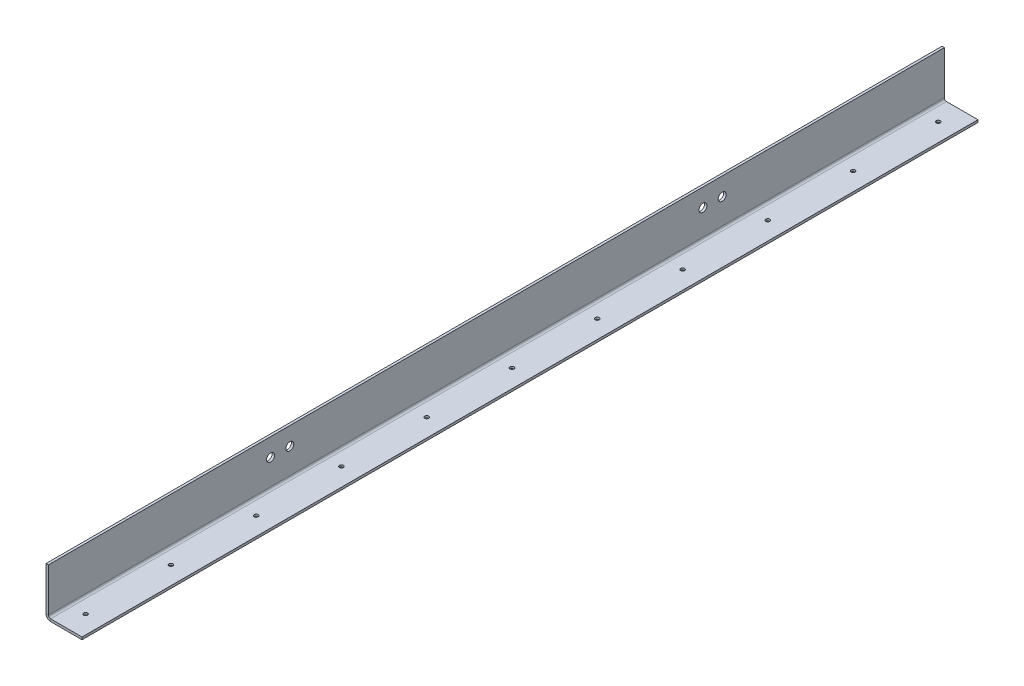
ISO-10303-21;
HEADER;
FILE_DESCRIPTION(('STEP AP214'),'2;1');
FILE_NAME('part.step','',(''),(''),'','','');
FILE_SCHEMA(('AUTOMOTIVE_DESIGN { 1 0 10303 214 1 1 1 1 }'));
ENDSEC;
DATA;
#1=APPLICATION_CONTEXT('core data for automotive mechanical design processes');
#2=APPLICATION_PROTOCOL_DEFINITION('international standard','automotive_design',2000,#1);
#3=PRODUCT_CONTEXT('',#1,'mechanical');
#4=PRODUCT('Part','Part','',(#3));
#5=PRODUCT_RELATED_PRODUCT_CATEGORY('part','',(#4));
#6=PRODUCT_DEFINITION_FORMATION('','',#4);
#7=PRODUCT_DEFINITION_CONTEXT('part definition',#1,'design');
#8=PRODUCT_DEFINITION('design','',#6,#7);
#9=PRODUCT_DEFINITION_SHAPE('','',#8);
#10=(LENGTH_UNIT() NAMED_UNIT(*) SI_UNIT(.MILLI.,.METRE.));
#11=(NAMED_UNIT(*) PLANE_ANGLE_UNIT() SI_UNIT($,.RADIAN.));
#12=(NAMED_UNIT(*) SI_UNIT($,.STERADIAN.) SOLID_ANGLE_UNIT());
#13=UNCERTAINTY_MEASURE_WITH_UNIT(LENGTH_MEASURE(1.E-05),#10,'distance_accuracy_value','');
#14=(GEOMETRIC_REPRESENTATION_CONTEXT(3) GLOBAL_UNCERTAINTY_ASSIGNED_CONTEXT((#13)) GLOBAL_UNIT_ASSIGNED_CONTEXT((#10,
#11,#12)) REPRESENTATION_CONTEXT('',''));
#15=CARTESIAN_POINT('',(0.,0.,0.));
#16=DIRECTION('',(0.,0.,1.));
#17=DIRECTION('',(1.,0.,0.));
#18=AXIS2_PLACEMENT_3D('',#15,#16,#17);
#19=CARTESIAN_POINT('',(0.,3.8,746.));
#20=DIRECTION('',(0.,0.,1.));
#21=DIRECTION('',(1.,0.,0.));
#22=AXIS2_PLACEMENT_3D('',#19,#20,#21);
#23=PLANE('',#22);
#24=DIRECTION('',(1.,0.,0.));
#25=VECTOR('',#24,1.);
#26=CARTESIAN_POINT('',(0.,3.8,746.));
#27=LINE('',#26,#25);
#28=CARTESIAN_POINT('',(0.,3.8,746.));
#29=VERTEX_POINT('',#28);
#30=CARTESIAN_POINT('',(2.,3.8,746.));
#31=VERTEX_POINT('',#30);
#32=EDGE_CURVE('E11',#29,#31,#27,.T.);
#33=ORIENTED_EDGE('',*,*,#32,.F.);
#34=CARTESIAN_POINT('',(3.8,3.8,746.));
#35=DIRECTION('',(0.,0.,1.));
#36=DIRECTION('',(1.,0.,0.));
#37=AXIS2_PLACEMENT_3D('',#34,#35,#36);
#38=CIRCLE('',#37,3.8);
#39=CARTESIAN_POINT('',(3.8,0.,746.));
#40=VERTEX_POINT('',#39);
#41=EDGE_CURVE('E138',#40,#29,#38,.F.);
#42=ORIENTED_EDGE('',*,*,#41,.F.);
#43=DIRECTION('',(0.,-1.,0.));
#44=VECTOR('',#43,1.);
#45=CARTESIAN_POINT('',(3.8,2.,746.));
#46=LINE('',#45,#44);
#47=CARTESIAN_POINT('',(3.8,2.,746.));
#48=VERTEX_POINT('',#47);
#49=EDGE_CURVE('E48',#48,#40,#46,.T.);
#50=ORIENTED_EDGE('',*,*,#49,.F.);
#51=CARTESIAN_POINT('',(3.8,3.8,746.));
#52=DIRECTION('',(0.,0.,1.));
#53=DIRECTION('',(1.,0.,0.));
#54=AXIS2_PLACEMENT_3D('',#51,#52,#53);
#55=CIRCLE('',#54,1.8);
#56=EDGE_CURVE('E131',#48,#31,#55,.F.);
#57=ORIENTED_EDGE('',*,*,#56,.T.);
#58=EDGE_LOOP('',(#33,#42,#50,#57));
#59=FACE_BOUND('',#58,.T.);
#60=ADVANCED_FACE('F39',(#59),#23,.T.);
#61=CARTESIAN_POINT('',(3.8,2.,746.));
#62=DIRECTION('',(0.,0.,1.));
#63=DIRECTION('',(1.,0.,0.));
#64=AXIS2_PLACEMENT_3D('',#61,#62,#63);
#65=PLANE('',#64);
#66=DIRECTION('',(0.,1.,0.));
#67=VECTOR('',#66,1.);
#68=CARTESIAN_POINT('',(0.,0.,746.));
#69=LINE('',#68,#67);
#70=CARTESIAN_POINT('',(0.,40.,746.));
#71=VERTEX_POINT('',#70);
#72=EDGE_CURVE('E277',#29,#71,#69,.T.);
#73=ORIENTED_EDGE('',*,*,#72,.F.);
#74=ORIENTED_EDGE('',*,*,#32,.T.);
#75=DIRECTION('',(0.,1.,0.));
#76=VECTOR('',#75,1.);
#77=CARTESIAN_POINT('',(2.,0.,746.));
#78=LINE('',#77,#76);
#79=CARTESIAN_POINT('',(2.,40.,746.));
#80=VERTEX_POINT('',#79);
#81=EDGE_CURVE('E97',#31,#80,#78,.T.);
#82=ORIENTED_EDGE('',*,*,#81,.T.);
#83=DIRECTION('',(1.,0.,0.));
#84=VECTOR('',#83,1.);
#85=CARTESIAN_POINT('',(0.,40.,746.));
#86=LINE('',#85,#84);
#87=EDGE_CURVE('E274',#71,#80,#86,.T.);
#88=ORIENTED_EDGE('',*,*,#87,.F.);
#89=EDGE_LOOP('',(#73,#74,#82,#88));
#90=FACE_BOUND('',#89,.T.);
#91=ADVANCED_FACE('F297',(#90),#65,.T.);
#92=CARTESIAN_POINT('',(3.8,0.,0.));
#93=DIRECTION('',(0.,0.,-1.));
#94=DIRECTION('',(-1.,0.,0.));
#95=AXIS2_PLACEMENT_3D('',#92,#93,#94);
#96=PLANE('',#95);
#97=DIRECTION('',(0.,1.,0.));
#98=VECTOR('',#97,1.);
#99=CARTESIAN_POINT('',(3.8,0.,0.));
#100=LINE('',#99,#98);
#101=CARTESIAN_POINT('',(3.8,0.,0.));
#102=VERTEX_POINT('',#101);
#103=CARTESIAN_POINT('',(3.8,2.,0.));
#104=VERTEX_POINT('',#103);
#105=EDGE_CURVE('E84',#102,#104,#100,.T.);
#106=ORIENTED_EDGE('',*,*,#105,.F.);
#107=CARTESIAN_POINT('',(3.8,3.8,0.));
#108=DIRECTION('',(0.,0.,1.));
#109=DIRECTION('',(1.,0.,0.));
#110=AXIS2_PLACEMENT_3D('',#107,#108,#109);
#111=CIRCLE('',#110,3.8);
#112=CARTESIAN_POINT('',(0.,3.8,0.));
#113=VERTEX_POINT('',#112);
#114=EDGE_CURVE('E154',#102,#113,#111,.F.);
#115=ORIENTED_EDGE('',*,*,#114,.T.);
#116=DIRECTION('',(-1.,0.,0.));
#117=VECTOR('',#116,1.);
#118=CARTESIAN_POINT('',(2.,3.8,0.));
#119=LINE('',#118,#117);
#120=CARTESIAN_POINT('',(2.,3.8,0.));
#121=VERTEX_POINT('',#120);
#122=EDGE_CURVE('E91',#121,#113,#119,.T.);
#123=ORIENTED_EDGE('',*,*,#122,.F.);
#124=CARTESIAN_POINT('',(3.8,3.8,0.));
#125=DIRECTION('',(0.,0.,1.));
#126=DIRECTION('',(1.,0.,0.));
#127=AXIS2_PLACEMENT_3D('',#124,#125,#126);
#128=CIRCLE('',#127,1.8);
#129=EDGE_CURVE('E161',#104,#121,#128,.F.);
#130=ORIENTED_EDGE('',*,*,#129,.F.);
#131=EDGE_LOOP('',(#106,#115,#123,#130));
#132=FACE_BOUND('',#131,.T.);
#133=ADVANCED_FACE('F295',(#132),#96,.T.);
#134=CARTESIAN_POINT('',(2.,3.8,0.));
#135=DIRECTION('',(0.,0.,-1.));
#136=DIRECTION('',(-1.,0.,0.));
#137=AXIS2_PLACEMENT_3D('',#134,#135,#136);
#138=PLANE('',#137);
#139=DIRECTION('',(-1.,0.,0.));
#140=VECTOR('',#139,1.);
#141=CARTESIAN_POINT('',(0.,0.,0.));
#142=LINE('',#141,#140);
#143=CARTESIAN_POINT('',(30.,0.,0.));
#144=VERTEX_POINT('',#143);
#145=EDGE_CURVE('E156',#144,#102,#142,.T.);
#146=ORIENTED_EDGE('',*,*,#145,.T.);
#147=ORIENTED_EDGE('',*,*,#105,.T.);
#148=DIRECTION('',(1.,0.,0.));
#149=VECTOR('',#148,1.);
#150=CARTESIAN_POINT('',(0.,2.,0.));
#151=LINE('',#150,#149);
#152=CARTESIAN_POINT('',(30.,2.,0.));
#153=VERTEX_POINT('',#152);
#154=EDGE_CURVE('E159',#153,#104,#151,.F.);
#155=ORIENTED_EDGE('',*,*,#154,.F.);
#156=DIRECTION('',(0.,-1.,0.));
#157=VECTOR('',#156,1.);
#158=CARTESIAN_POINT('',(30.,2.,0.));
#159=LINE('',#158,#157);
#160=EDGE_CURVE('E119',#153,#144,#159,.T.);
#161=ORIENTED_EDGE('',*,*,#160,.T.);
#162=EDGE_LOOP('',(#146,#147,#155,#161));
#163=FACE_BOUND('',#162,.T.);
#164=ADVANCED_FACE('F291',(#163),#138,.T.);
#165=CARTESIAN_POINT('',(2.,0.,746.));
#166=DIRECTION('',(-1.,0.,0.));
#167=DIRECTION('',(0.,0.,1.));
#168=AXIS2_PLACEMENT_3D('',#165,#166,#167);
#169=PLANE('',#168);
#170=CARTESIAN_POINT('',(2.,25.,561.));
#171=DIRECTION('',(-1.,0.,0.));
#172=DIRECTION('',(0.,0.,1.));
#173=AXIS2_PLACEMENT_3D('',#170,#171,#172);
#174=CIRCLE('',#173,3.29999999999999);
#175=CARTESIAN_POINT('',(2.,25.,564.3));
#176=VERTEX_POINT('',#175);
#177=EDGE_CURVE('E705',#176,#176,#174,.T.);
#178=ORIENTED_EDGE('',*,*,#177,.T.);
#179=EDGE_LOOP('',(#178));
#180=FACE_BOUND('',#179,.T.);
#181=CARTESIAN_POINT('',(2.,25.,545.));
#182=DIRECTION('',(-1.,0.,0.));
#183=DIRECTION('',(0.,0.,1.));
#184=AXIS2_PLACEMENT_3D('',#181,#182,#183);
#185=CIRCLE('',#184,3.29999999999999);
#186=CARTESIAN_POINT('',(2.,25.,548.3));
#187=VERTEX_POINT('',#186);
#188=EDGE_CURVE('E709',#187,#187,#185,.T.);
#189=ORIENTED_EDGE('',*,*,#188,.T.);
#190=EDGE_LOOP('',(#189));
#191=FACE_BOUND('',#190,.T.);
#192=CARTESIAN_POINT('',(2.,25.,185.));
#193=DIRECTION('',(-1.,0.,0.));
#194=DIRECTION('',(0.,0.,1.));
#195=AXIS2_PLACEMENT_3D('',#192,#193,#194);
#196=CIRCLE('',#195,3.29999999999999);
#197=CARTESIAN_POINT('',(2.,25.,188.3));
#198=VERTEX_POINT('',#197);
#199=EDGE_CURVE('E718',#198,#198,#196,.T.);
#200=ORIENTED_EDGE('',*,*,#199,.T.);
#201=EDGE_LOOP('',(#200));
#202=FACE_BOUND('',#201,.T.);
#203=CARTESIAN_POINT('',(2.,25.,201.));
#204=DIRECTION('',(-1.,0.,0.));
#205=DIRECTION('',(0.,0.,1.));
#206=AXIS2_PLACEMENT_3D('',#203,#204,#205);
#207=CIRCLE('',#206,3.29999999999999);
#208=CARTESIAN_POINT('',(2.,25.,204.3));
#209=VERTEX_POINT('',#208);
#210=EDGE_CURVE('E724',#209,#209,#207,.T.);
#211=ORIENTED_EDGE('',*,*,#210,.T.);
#212=EDGE_LOOP('',(#211));
#213=FACE_BOUND('',#212,.T.);
#214=DIRECTION('',(0.,1.,0.));
#215=VECTOR('',#214,1.);
#216=CARTESIAN_POINT('',(2.,0.,0.));
#217=LINE('',#216,#215);
#218=CARTESIAN_POINT('',(2.,40.,0.));
#219=VERTEX_POINT('',#218);
#220=EDGE_CURVE('E144',#121,#219,#217,.T.);
#221=ORIENTED_EDGE('',*,*,#220,.T.);
#222=DIRECTION('',(0.,0.,-1.));
#223=VECTOR('',#222,1.);
#224=CARTESIAN_POINT('',(2.,40.,746.));
#225=LINE('',#224,#223);
#226=EDGE_CURVE('E175',#80,#219,#225,.T.);
#227=ORIENTED_EDGE('',*,*,#226,.F.);
#228=ORIENTED_EDGE('',*,*,#81,.F.);
#229=DIRECTION('',(0.,0.,-1.));
#230=VECTOR('',#229,1.);
#231=CARTESIAN_POINT('',(2.,3.8,746.));
#232=LINE('',#231,#230);
#233=EDGE_CURVE('E143',#31,#121,#232,.T.);
#234=ORIENTED_EDGE('',*,*,#233,.T.);
#235=EDGE_LOOP('',(#221,#227,#228,#234));
#236=FACE_BOUND('',#235,.T.);
#237=ADVANCED_FACE('F303',(#180,#191,#202,#213,#236),#169,.F.);
#238=CARTESIAN_POINT('',(0.,40.,746.));
#239=DIRECTION('',(0.,1.,0.));
#240=DIRECTION('',(0.,0.,1.));
#241=AXIS2_PLACEMENT_3D('',#238,#239,#240);
#242=PLANE('',#241);
#243=DIRECTION('',(1.,0.,0.));
#244=VECTOR('',#243,1.);
#245=CARTESIAN_POINT('',(0.,40.,0.));
#246=LINE('',#245,#244);
#247=CARTESIAN_POINT('',(0.,40.,0.));
#248=VERTEX_POINT('',#247);
#249=EDGE_CURVE('E147',#248,#219,#246,.T.);
#250=ORIENTED_EDGE('',*,*,#249,.F.);
#251=DIRECTION('',(0.,0.,-1.));
#252=VECTOR('',#251,1.);
#253=CARTESIAN_POINT('',(0.,40.,746.));
#254=LINE('',#253,#252);
#255=EDGE_CURVE('E173',#71,#248,#254,.T.);
#256=ORIENTED_EDGE('',*,*,#255,.F.);
#257=ORIENTED_EDGE('',*,*,#87,.T.);
#258=ORIENTED_EDGE('',*,*,#226,.T.);
#259=EDGE_LOOP('',(#250,#256,#257,#258));
#260=FACE_BOUND('',#259,.T.);
#261=ADVANCED_FACE('F332',(#260),#242,.T.);
#262=CARTESIAN_POINT('',(0.,0.,746.));
#263=DIRECTION('',(-1.,0.,0.));
#264=DIRECTION('',(0.,0.,1.));
#265=AXIS2_PLACEMENT_3D('',#262,#263,#264);
#266=PLANE('',#265);
#267=CARTESIAN_POINT('',(0.,25.,561.));
#268=DIRECTION('',(-1.,0.,0.));
#269=DIRECTION('',(0.,0.,1.));
#270=AXIS2_PLACEMENT_3D('',#267,#268,#269);
#271=CIRCLE('',#270,3.29999999999999);
#272=CARTESIAN_POINT('',(0.,25.,564.3));
#273=VERTEX_POINT('',#272);
#274=EDGE_CURVE('E702',#273,#273,#271,.T.);
#275=ORIENTED_EDGE('',*,*,#274,.F.);
#276=EDGE_LOOP('',(#275));
#277=FACE_BOUND('',#276,.T.);
#278=CARTESIAN_POINT('',(0.,25.,545.));
#279=DIRECTION('',(-1.,0.,0.));
#280=DIRECTION('',(0.,0.,1.));
#281=AXIS2_PLACEMENT_3D('',#278,#279,#280);
#282=CIRCLE('',#281,3.29999999999999);
#283=CARTESIAN_POINT('',(0.,25.,548.3));
#284=VERTEX_POINT('',#283);
#285=EDGE_CURVE('E706',#284,#284,#282,.T.);
#286=ORIENTED_EDGE('',*,*,#285,.F.);
#287=EDGE_LOOP('',(#286));
#288=FACE_BOUND('',#287,.T.);
#289=CARTESIAN_POINT('',(0.,25.,185.));
#290=DIRECTION('',(-1.,0.,0.));
#291=DIRECTION('',(0.,0.,1.));
#292=AXIS2_PLACEMENT_3D('',#289,#290,#291);
#293=CIRCLE('',#292,3.29999999999999);
#294=CARTESIAN_POINT('',(0.,25.,188.3));
#295=VERTEX_POINT('',#294);
#296=EDGE_CURVE('E715',#295,#295,#293,.T.);
#297=ORIENTED_EDGE('',*,*,#296,.F.);
#298=EDGE_LOOP('',(#297));
#299=FACE_BOUND('',#298,.T.);
#300=CARTESIAN_POINT('',(0.,25.,201.));
#301=DIRECTION('',(-1.,0.,0.));
#302=DIRECTION('',(0.,0.,1.));
#303=AXIS2_PLACEMENT_3D('',#300,#301,#302);
#304=CIRCLE('',#303,3.29999999999999);
#305=CARTESIAN_POINT('',(0.,25.,204.3));
#306=VERTEX_POINT('',#305);
#307=EDGE_CURVE('E721',#306,#306,#304,.T.);
#308=ORIENTED_EDGE('',*,*,#307,.F.);
#309=EDGE_LOOP('',(#308));
#310=FACE_BOUND('',#309,.T.);
#311=DIRECTION('',(0.,1.,0.));
#312=VECTOR('',#311,1.);
#313=CARTESIAN_POINT('',(0.,0.,0.));
#314=LINE('',#313,#312);
#315=EDGE_CURVE('E151',#113,#248,#314,.T.);
#316=ORIENTED_EDGE('',*,*,#315,.F.);
#317=DIRECTION('',(0.,0.,-1.));
#318=VECTOR('',#317,1.);
#319=CARTESIAN_POINT('',(0.,3.8,746.));
#320=LINE('',#319,#318);
#321=EDGE_CURVE('E170',#29,#113,#320,.T.);
#322=ORIENTED_EDGE('',*,*,#321,.F.);
#323=ORIENTED_EDGE('',*,*,#72,.T.);
#324=ORIENTED_EDGE('',*,*,#255,.T.);
#325=EDGE_LOOP('',(#316,#322,#323,#324));
#326=FACE_BOUND('',#325,.T.);
#327=ADVANCED_FACE('F337',(#277,#288,#299,#310,#326),#266,.T.);
#328=CARTESIAN_POINT('',(3.8,3.8,746.));
#329=DIRECTION('',(0.,0.,-1.));
#330=DIRECTION('',(-1.,0.,0.));
#331=AXIS2_PLACEMENT_3D('',#328,#329,#330);
#332=CYLINDRICAL_SURFACE('',#331,3.8);
#333=ORIENTED_EDGE('',*,*,#114,.F.);
#334=DIRECTION('',(0.,0.,-1.));
#335=VECTOR('',#334,1.);
#336=CARTESIAN_POINT('',(3.8,0.,746.));
#337=LINE('',#336,#335);
#338=EDGE_CURVE('E167',#40,#102,#337,.T.);
#339=ORIENTED_EDGE('',*,*,#338,.F.);
#340=ORIENTED_EDGE('',*,*,#41,.T.);
#341=ORIENTED_EDGE('',*,*,#321,.T.);
#342=EDGE_LOOP('',(#333,#339,#340,#341));
#343=FACE_BOUND('',#342,.T.);
#344=ADVANCED_FACE('F284',(#343),#332,.T.);
#345=CARTESIAN_POINT('',(0.,0.,746.));
#346=DIRECTION('',(0.,-1.,0.));
#347=DIRECTION('',(0.,0.,-1.));
#348=AXIS2_PLACEMENT_3D('',#345,#346,#347);
#349=PLANE('',#348);
#350=CARTESIAN_POINT('',(15.,0.,18.));
#351=DIRECTION('',(0.,-1.,0.));
#352=DIRECTION('',(0.,0.,-1.));
#353=AXIS2_PLACEMENT_3D('',#350,#351,#352);
#354=CIRCLE('',#353,2.025);
#355=CARTESIAN_POINT('',(15.,0.,15.975));
#356=VERTEX_POINT('',#355);
#357=EDGE_CURVE('E727',#356,#356,#354,.T.);
#358=ORIENTED_EDGE('',*,*,#357,.F.);
#359=EDGE_LOOP('',(#358));
#360=FACE_BOUND('',#359,.T.);
#361=CARTESIAN_POINT('',(15.,0.,89.));
#362=DIRECTION('',(0.,-1.,0.));
#363=DIRECTION('',(0.,0.,-1.));
#364=AXIS2_PLACEMENT_3D('',#361,#362,#363);
#365=CIRCLE('',#364,2.025);
#366=CARTESIAN_POINT('',(15.,0.,86.975));
#367=VERTEX_POINT('',#366);
#368=EDGE_CURVE('E231',#367,#367,#365,.T.);
#369=ORIENTED_EDGE('',*,*,#368,.F.);
#370=EDGE_LOOP('',(#369));
#371=FACE_BOUND('',#370,.T.);
#372=CARTESIAN_POINT('',(15.,0.,160.));
#373=DIRECTION('',(0.,-1.,0.));
#374=DIRECTION('',(0.,0.,-1.));
#375=AXIS2_PLACEMENT_3D('',#372,#373,#374);
#376=CIRCLE('',#375,2.025);
#377=CARTESIAN_POINT('',(15.,0.,157.975));
#378=VERTEX_POINT('',#377);
#379=EDGE_CURVE('E224',#378,#378,#376,.T.);
#380=ORIENTED_EDGE('',*,*,#379,.F.);
#381=EDGE_LOOP('',(#380));
#382=FACE_BOUND('',#381,.T.);
#383=CARTESIAN_POINT('',(15.,0.,231.));
#384=DIRECTION('',(0.,-1.,0.));
#385=DIRECTION('',(0.,0.,-1.));
#386=AXIS2_PLACEMENT_3D('',#383,#384,#385);
#387=CIRCLE('',#386,2.025);
#388=CARTESIAN_POINT('',(15.,0.,228.975));
#389=VERTEX_POINT('',#388);
#390=EDGE_CURVE('E220',#389,#389,#387,.T.);
#391=ORIENTED_EDGE('',*,*,#390,.F.);
#392=EDGE_LOOP('',(#391));
#393=FACE_BOUND('',#392,.T.);
#394=CARTESIAN_POINT('',(15.,0.,302.));
#395=DIRECTION('',(0.,-1.,0.));
#396=DIRECTION('',(0.,0.,-1.));
#397=AXIS2_PLACEMENT_3D('',#394,#395,#396);
#398=CIRCLE('',#397,2.025);
#399=CARTESIAN_POINT('',(15.,0.,299.975));
#400=VERTEX_POINT('',#399);
#401=EDGE_CURVE('E216',#400,#400,#398,.T.);
#402=ORIENTED_EDGE('',*,*,#401,.F.);
#403=EDGE_LOOP('',(#402));
#404=FACE_BOUND('',#403,.T.);
#405=CARTESIAN_POINT('',(15.,0.,373.));
#406=DIRECTION('',(0.,-1.,0.));
#407=DIRECTION('',(0.,0.,-1.));
#408=AXIS2_PLACEMENT_3D('',#405,#406,#407);
#409=CIRCLE('',#408,2.025);
#410=CARTESIAN_POINT('',(15.,0.,370.975));
#411=VERTEX_POINT('',#410);
#412=EDGE_CURVE('E211',#411,#411,#409,.T.);
#413=ORIENTED_EDGE('',*,*,#412,.F.);
#414=EDGE_LOOP('',(#413));
#415=FACE_BOUND('',#414,.T.);
#416=CARTESIAN_POINT('',(14.9999999999999,0.,444.));
#417=DIRECTION('',(0.,-1.,0.));
#418=DIRECTION('',(0.,0.,-1.));
#419=AXIS2_PLACEMENT_3D('',#416,#417,#418);
#420=CIRCLE('',#419,2.025);
#421=CARTESIAN_POINT('',(14.9999999999999,0.,441.975));
#422=VERTEX_POINT('',#421);
#423=EDGE_CURVE('E206',#422,#422,#420,.T.);
#424=ORIENTED_EDGE('',*,*,#423,.F.);
#425=EDGE_LOOP('',(#424));
#426=FACE_BOUND('',#425,.T.);
#427=CARTESIAN_POINT('',(14.9999999999999,0.,515.));
#428=DIRECTION('',(0.,-1.,0.));
#429=DIRECTION('',(0.,0.,-1.));
#430=AXIS2_PLACEMENT_3D('',#427,#428,#429);
#431=CIRCLE('',#430,2.025);
#432=CARTESIAN_POINT('',(14.9999999999999,0.,512.975));
#433=VERTEX_POINT('',#432);
#434=EDGE_CURVE('E201',#433,#433,#431,.T.);
#435=ORIENTED_EDGE('',*,*,#434,.F.);
#436=EDGE_LOOP('',(#435));
#437=FACE_BOUND('',#436,.T.);
#438=CARTESIAN_POINT('',(14.9999999999999,0.,586.));
#439=DIRECTION('',(0.,-1.,0.));
#440=DIRECTION('',(0.,0.,-1.));
#441=AXIS2_PLACEMENT_3D('',#438,#439,#440);
#442=CIRCLE('',#441,2.025);
#443=CARTESIAN_POINT('',(14.9999999999999,0.,583.975));
#444=VERTEX_POINT('',#443);
#445=EDGE_CURVE('E196',#444,#444,#442,.T.);
#446=ORIENTED_EDGE('',*,*,#445,.F.);
#447=EDGE_LOOP('',(#446));
#448=FACE_BOUND('',#447,.T.);
#449=CARTESIAN_POINT('',(14.9999999999999,0.,657.));
#450=DIRECTION('',(0.,-1.,0.));
#451=DIRECTION('',(0.,0.,-1.));
#452=AXIS2_PLACEMENT_3D('',#449,#450,#451);
#453=CIRCLE('',#452,2.025);
#454=CARTESIAN_POINT('',(14.9999999999999,0.,654.975));
#455=VERTEX_POINT('',#454);
#456=EDGE_CURVE('E191',#455,#455,#453,.T.);
#457=ORIENTED_EDGE('',*,*,#456,.F.);
#458=EDGE_LOOP('',(#457));
#459=FACE_BOUND('',#458,.T.);
#460=CARTESIAN_POINT('',(14.9999999999999,0.,728.));
#461=DIRECTION('',(0.,-1.,0.));
#462=DIRECTION('',(0.,0.,-1.));
#463=AXIS2_PLACEMENT_3D('',#460,#461,#462);
#464=CIRCLE('',#463,2.025);
#465=CARTESIAN_POINT('',(14.9999999999999,0.,725.975));
#466=VERTEX_POINT('',#465);
#467=EDGE_CURVE('E186',#466,#466,#464,.T.);
#468=ORIENTED_EDGE('',*,*,#467,.F.);
#469=EDGE_LOOP('',(#468));
#470=FACE_BOUND('',#469,.T.);
#471=ORIENTED_EDGE('',*,*,#145,.F.);
#472=DIRECTION('',(0.,0.,-1.));
#473=VECTOR('',#472,1.);
#474=CARTESIAN_POINT('',(30.,0.,746.));
#475=LINE('',#474,#473);
#476=CARTESIAN_POINT('',(30.,0.,746.));
#477=VERTEX_POINT('',#476);
#478=EDGE_CURVE('E121',#477,#144,#475,.T.);
#479=ORIENTED_EDGE('',*,*,#478,.F.);
#480=DIRECTION('',(-1.,0.,0.));
#481=VECTOR('',#480,1.);
#482=CARTESIAN_POINT('',(0.,0.,746.));
#483=LINE('',#482,#481);
#484=EDGE_CURVE('E136',#477,#40,#483,.T.);
#485=ORIENTED_EDGE('',*,*,#484,.T.);
#486=ORIENTED_EDGE('',*,*,#338,.T.);
#487=EDGE_LOOP('',(#471,#479,#485,#486));
#488=FACE_BOUND('',#487,.T.);
#489=ADVANCED_FACE('F290',(#360,#371,#382,#393,#404,#415,#426,#437,#448,#459,#470,#488),#349,.T.);
#490=CARTESIAN_POINT('',(30.,2.,746.));
#491=DIRECTION('',(1.,0.,0.));
#492=DIRECTION('',(0.,0.,-1.));
#493=AXIS2_PLACEMENT_3D('',#490,#491,#492);
#494=PLANE('',#493);
#495=ORIENTED_EDGE('',*,*,#160,.F.);
#496=DIRECTION('',(0.,0.,-1.));
#497=VECTOR('',#496,1.);
#498=CARTESIAN_POINT('',(30.,2.,746.));
#499=LINE('',#498,#497);
#500=CARTESIAN_POINT('',(30.,2.,746.));
#501=VERTEX_POINT('',#500);
#502=EDGE_CURVE('E113',#501,#153,#499,.T.);
#503=ORIENTED_EDGE('',*,*,#502,.F.);
#504=DIRECTION('',(0.,-1.,0.));
#505=VECTOR('',#504,1.);
#506=CARTESIAN_POINT('',(30.,2.,746.));
#507=LINE('',#506,#505);
#508=EDGE_CURVE('E117',#501,#477,#507,.T.);
#509=ORIENTED_EDGE('',*,*,#508,.T.);
#510=ORIENTED_EDGE('',*,*,#478,.T.);
#511=EDGE_LOOP('',(#495,#503,#509,#510));
#512=FACE_BOUND('',#511,.T.);
#513=ADVANCED_FACE('F115',(#512),#494,.T.);
#514=CARTESIAN_POINT('',(0.,2.,746.));
#515=DIRECTION('',(0.,-1.,0.));
#516=DIRECTION('',(0.,0.,-1.));
#517=AXIS2_PLACEMENT_3D('',#514,#515,#516);
#518=PLANE('',#517);
#519=CARTESIAN_POINT('',(15.,2.,18.));
#520=DIRECTION('',(0.,-1.,0.));
#521=DIRECTION('',(0.,0.,-1.));
#522=AXIS2_PLACEMENT_3D('',#519,#520,#521);
#523=CIRCLE('',#522,1.64999999999999);
#524=CARTESIAN_POINT('',(15.,2.,16.35));
#525=VERTEX_POINT('',#524);
#526=EDGE_CURVE('E42',#525,#525,#523,.T.);
#527=ORIENTED_EDGE('',*,*,#526,.T.);
#528=EDGE_LOOP('',(#527));
#529=FACE_BOUND('',#528,.T.);
#530=CARTESIAN_POINT('',(15.,2.,89.));
#531=DIRECTION('',(0.,-1.,0.));
#532=DIRECTION('',(0.,0.,-1.));
#533=AXIS2_PLACEMENT_3D('',#530,#531,#532);
#534=CIRCLE('',#533,1.64999999999999);
#535=CARTESIAN_POINT('',(15.,2.,87.35));
#536=VERTEX_POINT('',#535);
#537=EDGE_CURVE('E222',#536,#536,#534,.T.);
#538=ORIENTED_EDGE('',*,*,#537,.T.);
#539=EDGE_LOOP('',(#538));
#540=FACE_BOUND('',#539,.T.);
#541=CARTESIAN_POINT('',(15.,2.,160.));
#542=DIRECTION('',(0.,-1.,0.));
#543=DIRECTION('',(0.,0.,-1.));
#544=AXIS2_PLACEMENT_3D('',#541,#542,#543);
#545=CIRCLE('',#544,1.64999999999999);
#546=CARTESIAN_POINT('',(15.,2.,158.35));
#547=VERTEX_POINT('',#546);
#548=EDGE_CURVE('E218',#547,#547,#545,.T.);
#549=ORIENTED_EDGE('',*,*,#548,.T.);
#550=EDGE_LOOP('',(#549));
#551=FACE_BOUND('',#550,.T.);
#552=CARTESIAN_POINT('',(15.,2.,231.));
#553=DIRECTION('',(0.,-1.,0.));
#554=DIRECTION('',(0.,0.,-1.));
#555=AXIS2_PLACEMENT_3D('',#552,#553,#554);
#556=CIRCLE('',#555,1.64999999999999);
#557=CARTESIAN_POINT('',(15.,2.,229.35));
#558=VERTEX_POINT('',#557);
#559=EDGE_CURVE('E213',#558,#558,#556,.T.);
#560=ORIENTED_EDGE('',*,*,#559,.T.);
#561=EDGE_LOOP('',(#560));
#562=FACE_BOUND('',#561,.T.);
#563=CARTESIAN_POINT('',(15.,2.,302.));
#564=DIRECTION('',(0.,-1.,0.));
#565=DIRECTION('',(0.,0.,-1.));
#566=AXIS2_PLACEMENT_3D('',#563,#564,#565);
#567=CIRCLE('',#566,1.64999999999999);
#568=CARTESIAN_POINT('',(15.,2.,300.35));
#569=VERTEX_POINT('',#568);
#570=EDGE_CURVE('E208',#569,#569,#567,.T.);
#571=ORIENTED_EDGE('',*,*,#570,.T.);
#572=EDGE_LOOP('',(#571));
#573=FACE_BOUND('',#572,.T.);
#574=CARTESIAN_POINT('',(15.,2.,373.));
#575=DIRECTION('',(0.,-1.,0.));
#576=DIRECTION('',(0.,0.,-1.));
#577=AXIS2_PLACEMENT_3D('',#574,#575,#576);
#578=CIRCLE('',#577,1.64999999999999);
#579=CARTESIAN_POINT('',(15.,2.,371.35));
#580=VERTEX_POINT('',#579);
#581=EDGE_CURVE('E203',#580,#580,#578,.T.);
#582=ORIENTED_EDGE('',*,*,#581,.T.);
#583=EDGE_LOOP('',(#582));
#584=FACE_BOUND('',#583,.T.);
#585=CARTESIAN_POINT('',(14.9999999999999,2.,444.));
#586=DIRECTION('',(0.,-1.,0.));
#587=DIRECTION('',(0.,0.,-1.));
#588=AXIS2_PLACEMENT_3D('',#585,#586,#587);
#589=CIRCLE('',#588,1.64999999999999);
#590=CARTESIAN_POINT('',(14.9999999999999,2.,442.35));
#591=VERTEX_POINT('',#590);
#592=EDGE_CURVE('E198',#591,#591,#589,.T.);
#593=ORIENTED_EDGE('',*,*,#592,.T.);
#594=EDGE_LOOP('',(#593));
#595=FACE_BOUND('',#594,.T.);
#596=CARTESIAN_POINT('',(14.9999999999999,2.,515.));
#597=DIRECTION('',(0.,-1.,0.));
#598=DIRECTION('',(0.,0.,-1.));
#599=AXIS2_PLACEMENT_3D('',#596,#597,#598);
#600=CIRCLE('',#599,1.64999999999999);
#601=CARTESIAN_POINT('',(14.9999999999999,2.,513.35));
#602=VERTEX_POINT('',#601);
#603=EDGE_CURVE('E193',#602,#602,#600,.T.);
#604=ORIENTED_EDGE('',*,*,#603,.T.);
#605=EDGE_LOOP('',(#604));
#606=FACE_BOUND('',#605,.T.);
#607=CARTESIAN_POINT('',(14.9999999999999,2.,586.));
#608=DIRECTION('',(0.,-1.,0.));
#609=DIRECTION('',(0.,0.,-1.));
#610=AXIS2_PLACEMENT_3D('',#607,#608,#609);
#611=CIRCLE('',#610,1.64999999999999);
#612=CARTESIAN_POINT('',(14.9999999999999,2.,584.35));
#613=VERTEX_POINT('',#612);
#614=EDGE_CURVE('E188',#613,#613,#611,.T.);
#615=ORIENTED_EDGE('',*,*,#614,.T.);
#616=EDGE_LOOP('',(#615));
#617=FACE_BOUND('',#616,.T.);
#618=CARTESIAN_POINT('',(14.9999999999999,2.,657.));
#619=DIRECTION('',(0.,-1.,0.));
#620=DIRECTION('',(0.,0.,-1.));
#621=AXIS2_PLACEMENT_3D('',#618,#619,#620);
#622=CIRCLE('',#621,1.64999999999999);
#623=CARTESIAN_POINT('',(14.9999999999999,2.,655.35));
#624=VERTEX_POINT('',#623);
#625=EDGE_CURVE('E183',#624,#624,#622,.T.);
#626=ORIENTED_EDGE('',*,*,#625,.T.);
#627=EDGE_LOOP('',(#626));
#628=FACE_BOUND('',#627,.T.);
#629=CARTESIAN_POINT('',(14.9999999999999,2.,728.));
#630=DIRECTION('',(0.,-1.,0.));
#631=DIRECTION('',(0.,0.,-1.));
#632=AXIS2_PLACEMENT_3D('',#629,#630,#631);
#633=CIRCLE('',#632,1.64999999999999);
#634=CARTESIAN_POINT('',(14.9999999999999,2.,726.35));
#635=VERTEX_POINT('',#634);
#636=EDGE_CURVE('E148',#635,#635,#633,.T.);
#637=ORIENTED_EDGE('',*,*,#636,.T.);
#638=EDGE_LOOP('',(#637));
#639=FACE_BOUND('',#638,.T.);
#640=ORIENTED_EDGE('',*,*,#154,.T.);
#641=DIRECTION('',(0.,0.,-1.));
#642=VECTOR('',#641,1.);
#643=CARTESIAN_POINT('',(3.8,2.,746.));
#644=LINE('',#643,#642);
#645=EDGE_CURVE('E122',#48,#104,#644,.T.);
#646=ORIENTED_EDGE('',*,*,#645,.F.);
#647=DIRECTION('',(1.,0.,0.));
#648=VECTOR('',#647,1.);
#649=CARTESIAN_POINT('',(0.,2.,746.));
#650=LINE('',#649,#648);
#651=EDGE_CURVE('E126',#501,#48,#650,.F.);
#652=ORIENTED_EDGE('',*,*,#651,.F.);
#653=ORIENTED_EDGE('',*,*,#502,.T.);
#654=EDGE_LOOP('',(#640,#646,#652,#653));
#655=FACE_BOUND('',#654,.T.);
#656=ADVANCED_FACE('F127',(#529,#540,#551,#562,#573,#584,#595,#606,#617,#628,#639,#655),#518,.F.);
#657=CARTESIAN_POINT('',(3.8,3.8,746.));
#658=DIRECTION('',(0.,0.,-1.));
#659=DIRECTION('',(-1.,0.,0.));
#660=AXIS2_PLACEMENT_3D('',#657,#658,#659);
#661=CYLINDRICAL_SURFACE('',#660,1.8);
#662=ORIENTED_EDGE('',*,*,#129,.T.);
#663=ORIENTED_EDGE('',*,*,#233,.F.);
#664=ORIENTED_EDGE('',*,*,#56,.F.);
#665=ORIENTED_EDGE('',*,*,#645,.T.);
#666=EDGE_LOOP('',(#662,#663,#664,#665));
#667=FACE_BOUND('',#666,.T.);
#668=ADVANCED_FACE('F293',(#667),#661,.F.);
#669=CARTESIAN_POINT('',(3.8,3.8,746.));
#670=DIRECTION('',(0.,0.,1.));
#671=DIRECTION('',(1.,0.,0.));
#672=AXIS2_PLACEMENT_3D('',#669,#670,#671);
#673=PLANE('',#672);
#674=ORIENTED_EDGE('',*,*,#651,.T.);
#675=ORIENTED_EDGE('',*,*,#49,.T.);
#676=ORIENTED_EDGE('',*,*,#484,.F.);
#677=ORIENTED_EDGE('',*,*,#508,.F.);
#678=EDGE_LOOP('',(#674,#675,#676,#677));
#679=FACE_BOUND('',#678,.T.);
#680=ADVANCED_FACE('F134',(#679),#673,.T.);
#681=CARTESIAN_POINT('',(3.8,3.8,0.));
#682=DIRECTION('',(0.,0.,1.));
#683=DIRECTION('',(1.,0.,0.));
#684=AXIS2_PLACEMENT_3D('',#681,#682,#683);
#685=PLANE('',#684);
#686=ORIENTED_EDGE('',*,*,#220,.F.);
#687=ORIENTED_EDGE('',*,*,#122,.T.);
#688=ORIENTED_EDGE('',*,*,#315,.T.);
#689=ORIENTED_EDGE('',*,*,#249,.T.);
#690=EDGE_LOOP('',(#686,#687,#688,#689));
#691=FACE_BOUND('',#690,.T.);
#692=ADVANCED_FACE('F381',(#691),#685,.F.);
#693=CARTESIAN_POINT('',(14.9999999999999,0.,728.));
#694=DIRECTION('',(0.,-1.,0.));
#695=DIRECTION('',(0.,0.,-1.));
#696=AXIS2_PLACEMENT_3D('',#693,#694,#695);
#697=CYLINDRICAL_SURFACE('',#696,1.64999999999999);
#698=CARTESIAN_POINT('',(14.9999999999999,0.375,728.));
#699=DIRECTION('',(0.,-1.,0.));
#700=DIRECTION('',(0.,0.,-1.));
#701=AXIS2_PLACEMENT_3D('',#698,#699,#700);
#702=CIRCLE('',#701,1.64999999999999);
#703=CARTESIAN_POINT('',(14.9999999999999,0.375,726.35));
#704=VERTEX_POINT('',#703);
#705=EDGE_CURVE('E182',#704,#704,#702,.T.);
#706=ORIENTED_EDGE('',*,*,#705,.T.);
#707=EDGE_LOOP('',(#706));
#708=FACE_BOUND('',#707,.T.);
#709=ORIENTED_EDGE('',*,*,#636,.F.);
#710=EDGE_LOOP('',(#709));
#711=FACE_BOUND('',#710,.T.);
#712=ADVANCED_FACE('F391',(#708,#711),#697,.F.);
#713=CARTESIAN_POINT('',(14.9999999999999,0.,728.));
#714=DIRECTION('',(0.,-1.,0.));
#715=DIRECTION('',(0.,0.,-1.));
#716=AXIS2_PLACEMENT_3D('',#713,#714,#715);
#717=CONICAL_SURFACE('',#716,2.025,0.78539816339746);
#718=ORIENTED_EDGE('',*,*,#705,.F.);
#719=EDGE_LOOP('',(#718));
#720=FACE_BOUND('',#719,.T.);
#721=ORIENTED_EDGE('',*,*,#467,.T.);
#722=EDGE_LOOP('',(#721));
#723=FACE_BOUND('',#722,.T.);
#724=ADVANCED_FACE('F419',(#720,#723),#717,.F.);
#725=CARTESIAN_POINT('',(14.9999999999999,0.,657.));
#726=DIRECTION('',(0.,-1.,0.));
#727=DIRECTION('',(0.,0.,-1.));
#728=AXIS2_PLACEMENT_3D('',#725,#726,#727);
#729=CYLINDRICAL_SURFACE('',#728,1.64999999999999);
#730=CARTESIAN_POINT('',(14.9999999999999,0.375,657.));
#731=DIRECTION('',(0.,-1.,0.));
#732=DIRECTION('',(0.,0.,-1.));
#733=AXIS2_PLACEMENT_3D('',#730,#731,#732);
#734=CIRCLE('',#733,1.64999999999999);
#735=CARTESIAN_POINT('',(14.9999999999999,0.375,655.35));
#736=VERTEX_POINT('',#735);
#737=EDGE_CURVE('E187',#736,#736,#734,.T.);
#738=ORIENTED_EDGE('',*,*,#737,.T.);
#739=EDGE_LOOP('',(#738));
#740=FACE_BOUND('',#739,.T.);
#741=ORIENTED_EDGE('',*,*,#625,.F.);
#742=EDGE_LOOP('',(#741));
#743=FACE_BOUND('',#742,.T.);
#744=ADVANCED_FACE('F431',(#740,#743),#729,.F.);
#745=CARTESIAN_POINT('',(14.9999999999999,0.,657.));
#746=DIRECTION('',(0.,-1.,0.));
#747=DIRECTION('',(0.,0.,-1.));
#748=AXIS2_PLACEMENT_3D('',#745,#746,#747);
#749=CONICAL_SURFACE('',#748,2.025,0.78539816339746);
#750=ORIENTED_EDGE('',*,*,#737,.F.);
#751=EDGE_LOOP('',(#750));
#752=FACE_BOUND('',#751,.T.);
#753=ORIENTED_EDGE('',*,*,#456,.T.);
#754=EDGE_LOOP('',(#753));
#755=FACE_BOUND('',#754,.T.);
#756=ADVANCED_FACE('F441',(#752,#755),#749,.F.);
#757=CARTESIAN_POINT('',(14.9999999999999,0.,586.));
#758=DIRECTION('',(0.,-1.,0.));
#759=DIRECTION('',(0.,0.,-1.));
#760=AXIS2_PLACEMENT_3D('',#757,#758,#759);
#761=CYLINDRICAL_SURFACE('',#760,1.64999999999999);
#762=CARTESIAN_POINT('',(14.9999999999999,0.375,586.));
#763=DIRECTION('',(0.,-1.,0.));
#764=DIRECTION('',(0.,0.,-1.));
#765=AXIS2_PLACEMENT_3D('',#762,#763,#764);
#766=CIRCLE('',#765,1.64999999999999);
#767=CARTESIAN_POINT('',(14.9999999999999,0.375,584.35));
#768=VERTEX_POINT('',#767);
#769=EDGE_CURVE('E192',#768,#768,#766,.T.);
#770=ORIENTED_EDGE('',*,*,#769,.T.);
#771=EDGE_LOOP('',(#770));
#772=FACE_BOUND('',#771,.T.);
#773=ORIENTED_EDGE('',*,*,#614,.F.);
#774=EDGE_LOOP('',(#773));
#775=FACE_BOUND('',#774,.T.);
#776=ADVANCED_FACE('F452',(#772,#775),#761,.F.);
#777=CARTESIAN_POINT('',(14.9999999999999,0.,586.));
#778=DIRECTION('',(0.,-1.,0.));
#779=DIRECTION('',(0.,0.,-1.));
#780=AXIS2_PLACEMENT_3D('',#777,#778,#779);
#781=CONICAL_SURFACE('',#780,2.025,0.785398163397455);
#782=ORIENTED_EDGE('',*,*,#769,.F.);
#783=EDGE_LOOP('',(#782));
#784=FACE_BOUND('',#783,.T.);
#785=ORIENTED_EDGE('',*,*,#445,.T.);
#786=EDGE_LOOP('',(#785));
#787=FACE_BOUND('',#786,.T.);
#788=ADVANCED_FACE('F462',(#784,#787),#781,.F.);
#789=CARTESIAN_POINT('',(14.9999999999999,0.,515.));
#790=DIRECTION('',(0.,-1.,0.));
#791=DIRECTION('',(0.,0.,-1.));
#792=AXIS2_PLACEMENT_3D('',#789,#790,#791);
#793=CYLINDRICAL_SURFACE('',#792,1.64999999999999);
#794=CARTESIAN_POINT('',(14.9999999999999,0.375,515.));
#795=DIRECTION('',(0.,-1.,0.));
#796=DIRECTION('',(0.,0.,-1.));
#797=AXIS2_PLACEMENT_3D('',#794,#795,#796);
#798=CIRCLE('',#797,1.64999999999999);
#799=CARTESIAN_POINT('',(14.9999999999999,0.375,513.35));
#800=VERTEX_POINT('',#799);
#801=EDGE_CURVE('E197',#800,#800,#798,.T.);
#802=ORIENTED_EDGE('',*,*,#801,.T.);
#803=EDGE_LOOP('',(#802));
#804=FACE_BOUND('',#803,.T.);
#805=ORIENTED_EDGE('',*,*,#603,.F.);
#806=EDGE_LOOP('',(#805));
#807=FACE_BOUND('',#806,.T.);
#808=ADVANCED_FACE('F473',(#804,#807),#793,.F.);
#809=CARTESIAN_POINT('',(14.9999999999999,0.,515.));
#810=DIRECTION('',(0.,-1.,0.));
#811=DIRECTION('',(0.,0.,-1.));
#812=AXIS2_PLACEMENT_3D('',#809,#810,#811);
#813=CONICAL_SURFACE('',#812,2.025,0.785398163397455);
#814=ORIENTED_EDGE('',*,*,#801,.F.);
#815=EDGE_LOOP('',(#814));
#816=FACE_BOUND('',#815,.T.);
#817=ORIENTED_EDGE('',*,*,#434,.T.);
#818=EDGE_LOOP('',(#817));
#819=FACE_BOUND('',#818,.T.);
#820=ADVANCED_FACE('F483',(#816,#819),#813,.F.);
#821=CARTESIAN_POINT('',(14.9999999999999,0.,444.));
#822=DIRECTION('',(0.,-1.,0.));
#823=DIRECTION('',(0.,0.,-1.));
#824=AXIS2_PLACEMENT_3D('',#821,#822,#823);
#825=CYLINDRICAL_SURFACE('',#824,1.64999999999999);
#826=CARTESIAN_POINT('',(14.9999999999999,0.375,444.));
#827=DIRECTION('',(0.,-1.,0.));
#828=DIRECTION('',(0.,0.,-1.));
#829=AXIS2_PLACEMENT_3D('',#826,#827,#828);
#830=CIRCLE('',#829,1.64999999999999);
#831=CARTESIAN_POINT('',(14.9999999999999,0.375,442.35));
#832=VERTEX_POINT('',#831);
#833=EDGE_CURVE('E202',#832,#832,#830,.T.);
#834=ORIENTED_EDGE('',*,*,#833,.T.);
#835=EDGE_LOOP('',(#834));
#836=FACE_BOUND('',#835,.T.);
#837=ORIENTED_EDGE('',*,*,#592,.F.);
#838=EDGE_LOOP('',(#837));
#839=FACE_BOUND('',#838,.T.);
#840=ADVANCED_FACE('F494',(#836,#839),#825,.F.);
#841=CARTESIAN_POINT('',(14.9999999999999,0.,444.));
#842=DIRECTION('',(0.,-1.,0.));
#843=DIRECTION('',(0.,0.,-1.));
#844=AXIS2_PLACEMENT_3D('',#841,#842,#843);
#845=CONICAL_SURFACE('',#844,2.025,0.78539816339746);
#846=ORIENTED_EDGE('',*,*,#833,.F.);
#847=EDGE_LOOP('',(#846));
#848=FACE_BOUND('',#847,.T.);
#849=ORIENTED_EDGE('',*,*,#423,.T.);
#850=EDGE_LOOP('',(#849));
#851=FACE_BOUND('',#850,.T.);
#852=ADVANCED_FACE('F504',(#848,#851),#845,.F.);
#853=CARTESIAN_POINT('',(15.,0.,373.));
#854=DIRECTION('',(0.,-1.,0.));
#855=DIRECTION('',(0.,0.,-1.));
#856=AXIS2_PLACEMENT_3D('',#853,#854,#855);
#857=CYLINDRICAL_SURFACE('',#856,1.64999999999999);
#858=CARTESIAN_POINT('',(15.,0.375,373.));
#859=DIRECTION('',(0.,-1.,0.));
#860=DIRECTION('',(0.,0.,-1.));
#861=AXIS2_PLACEMENT_3D('',#858,#859,#860);
#862=CIRCLE('',#861,1.64999999999999);
#863=CARTESIAN_POINT('',(15.,0.375,371.35));
#864=VERTEX_POINT('',#863);
#865=EDGE_CURVE('E207',#864,#864,#862,.T.);
#866=ORIENTED_EDGE('',*,*,#865,.T.);
#867=EDGE_LOOP('',(#866));
#868=FACE_BOUND('',#867,.T.);
#869=ORIENTED_EDGE('',*,*,#581,.F.);
#870=EDGE_LOOP('',(#869));
#871=FACE_BOUND('',#870,.T.);
#872=ADVANCED_FACE('F515',(#868,#871),#857,.F.);
#873=CARTESIAN_POINT('',(15.,0.,373.));
#874=DIRECTION('',(0.,-1.,0.));
#875=DIRECTION('',(0.,0.,-1.));
#876=AXIS2_PLACEMENT_3D('',#873,#874,#875);
#877=CONICAL_SURFACE('',#876,2.025,0.78539816339746);
#878=ORIENTED_EDGE('',*,*,#865,.F.);
#879=EDGE_LOOP('',(#878));
#880=FACE_BOUND('',#879,.T.);
#881=ORIENTED_EDGE('',*,*,#412,.T.);
#882=EDGE_LOOP('',(#881));
#883=FACE_BOUND('',#882,.T.);
#884=ADVANCED_FACE('F525',(#880,#883),#877,.F.);
#885=CARTESIAN_POINT('',(15.,0.,302.));
#886=DIRECTION('',(0.,-1.,0.));
#887=DIRECTION('',(0.,0.,-1.));
#888=AXIS2_PLACEMENT_3D('',#885,#886,#887);
#889=CYLINDRICAL_SURFACE('',#888,1.64999999999999);
#890=CARTESIAN_POINT('',(15.,0.375,302.));
#891=DIRECTION('',(0.,-1.,0.));
#892=DIRECTION('',(0.,0.,-1.));
#893=AXIS2_PLACEMENT_3D('',#890,#891,#892);
#894=CIRCLE('',#893,1.64999999999999);
#895=CARTESIAN_POINT('',(15.,0.375,300.35));
#896=VERTEX_POINT('',#895);
#897=EDGE_CURVE('E212',#896,#896,#894,.T.);
#898=ORIENTED_EDGE('',*,*,#897,.T.);
#899=EDGE_LOOP('',(#898));
#900=FACE_BOUND('',#899,.T.);
#901=ORIENTED_EDGE('',*,*,#570,.F.);
#902=EDGE_LOOP('',(#901));
#903=FACE_BOUND('',#902,.T.);
#904=ADVANCED_FACE('F536',(#900,#903),#889,.F.);
#905=CARTESIAN_POINT('',(15.,0.,302.));
#906=DIRECTION('',(0.,-1.,0.));
#907=DIRECTION('',(0.,0.,-1.));
#908=AXIS2_PLACEMENT_3D('',#905,#906,#907);
#909=CONICAL_SURFACE('',#908,2.025,0.785398163397455);
#910=ORIENTED_EDGE('',*,*,#897,.F.);
#911=EDGE_LOOP('',(#910));
#912=FACE_BOUND('',#911,.T.);
#913=ORIENTED_EDGE('',*,*,#401,.T.);
#914=EDGE_LOOP('',(#913));
#915=FACE_BOUND('',#914,.T.);
#916=ADVANCED_FACE('F546',(#912,#915),#909,.F.);
#917=CARTESIAN_POINT('',(15.,0.,231.));
#918=DIRECTION('',(0.,-1.,0.));
#919=DIRECTION('',(0.,0.,-1.));
#920=AXIS2_PLACEMENT_3D('',#917,#918,#919);
#921=CYLINDRICAL_SURFACE('',#920,1.64999999999999);
#922=CARTESIAN_POINT('',(15.,0.375,231.));
#923=DIRECTION('',(0.,-1.,0.));
#924=DIRECTION('',(0.,0.,-1.));
#925=AXIS2_PLACEMENT_3D('',#922,#923,#924);
#926=CIRCLE('',#925,1.64999999999999);
#927=CARTESIAN_POINT('',(15.,0.375,229.35));
#928=VERTEX_POINT('',#927);
#929=EDGE_CURVE('E217',#928,#928,#926,.T.);
#930=ORIENTED_EDGE('',*,*,#929,.T.);
#931=EDGE_LOOP('',(#930));
#932=FACE_BOUND('',#931,.T.);
#933=ORIENTED_EDGE('',*,*,#559,.F.);
#934=EDGE_LOOP('',(#933));
#935=FACE_BOUND('',#934,.T.);
#936=ADVANCED_FACE('F557',(#932,#935),#921,.F.);
#937=CARTESIAN_POINT('',(15.,0.,231.));
#938=DIRECTION('',(0.,-1.,0.));
#939=DIRECTION('',(0.,0.,-1.));
#940=AXIS2_PLACEMENT_3D('',#937,#938,#939);
#941=CONICAL_SURFACE('',#940,2.025,0.785398163397455);
#942=ORIENTED_EDGE('',*,*,#929,.F.);
#943=EDGE_LOOP('',(#942));
#944=FACE_BOUND('',#943,.T.);
#945=ORIENTED_EDGE('',*,*,#390,.T.);
#946=EDGE_LOOP('',(#945));
#947=FACE_BOUND('',#946,.T.);
#948=ADVANCED_FACE('F567',(#944,#947),#941,.F.);
#949=CARTESIAN_POINT('',(15.,0.,160.));
#950=DIRECTION('',(0.,-1.,0.));
#951=DIRECTION('',(0.,0.,-1.));
#952=AXIS2_PLACEMENT_3D('',#949,#950,#951);
#953=CYLINDRICAL_SURFACE('',#952,1.64999999999999);
#954=CARTESIAN_POINT('',(15.,0.375,160.));
#955=DIRECTION('',(0.,-1.,0.));
#956=DIRECTION('',(0.,0.,-1.));
#957=AXIS2_PLACEMENT_3D('',#954,#955,#956);
#958=CIRCLE('',#957,1.64999999999999);
#959=CARTESIAN_POINT('',(15.,0.375,158.35));
#960=VERTEX_POINT('',#959);
#961=EDGE_CURVE('E221',#960,#960,#958,.T.);
#962=ORIENTED_EDGE('',*,*,#961,.T.);
#963=EDGE_LOOP('',(#962));
#964=FACE_BOUND('',#963,.T.);
#965=ORIENTED_EDGE('',*,*,#548,.F.);
#966=EDGE_LOOP('',(#965));
#967=FACE_BOUND('',#966,.T.);
#968=ADVANCED_FACE('F578',(#964,#967),#953,.F.);
#969=CARTESIAN_POINT('',(15.,0.,160.));
#970=DIRECTION('',(0.,-1.,0.));
#971=DIRECTION('',(0.,0.,-1.));
#972=AXIS2_PLACEMENT_3D('',#969,#970,#971);
#973=CONICAL_SURFACE('',#972,2.025,0.78539816339746);
#974=ORIENTED_EDGE('',*,*,#961,.F.);
#975=EDGE_LOOP('',(#974));
#976=FACE_BOUND('',#975,.T.);
#977=ORIENTED_EDGE('',*,*,#379,.T.);
#978=EDGE_LOOP('',(#977));
#979=FACE_BOUND('',#978,.T.);
#980=ADVANCED_FACE('F588',(#976,#979),#973,.F.);
#981=CARTESIAN_POINT('',(15.,0.,89.));
#982=DIRECTION('',(0.,-1.,0.));
#983=DIRECTION('',(0.,0.,-1.));
#984=AXIS2_PLACEMENT_3D('',#981,#982,#983);
#985=CYLINDRICAL_SURFACE('',#984,1.64999999999999);
#986=CARTESIAN_POINT('',(15.,0.375,89.));
#987=DIRECTION('',(0.,-1.,0.));
#988=DIRECTION('',(0.,0.,-1.));
#989=AXIS2_PLACEMENT_3D('',#986,#987,#988);
#990=CIRCLE('',#989,1.64999999999999);
#991=CARTESIAN_POINT('',(15.,0.375,87.35));
#992=VERTEX_POINT('',#991);
#993=EDGE_CURVE('E225',#992,#992,#990,.T.);
#994=ORIENTED_EDGE('',*,*,#993,.T.);
#995=EDGE_LOOP('',(#994));
#996=FACE_BOUND('',#995,.T.);
#997=ORIENTED_EDGE('',*,*,#537,.F.);
#998=EDGE_LOOP('',(#997));
#999=FACE_BOUND('',#998,.T.);
#1000=ADVANCED_FACE('F599',(#996,#999),#985,.F.);
#1001=CARTESIAN_POINT('',(15.,0.,89.));
#1002=DIRECTION('',(0.,-1.,0.));
#1003=DIRECTION('',(0.,0.,-1.));
#1004=AXIS2_PLACEMENT_3D('',#1001,#1002,#1003);
#1005=CONICAL_SURFACE('',#1004,2.025,0.78539816339746);
#1006=ORIENTED_EDGE('',*,*,#993,.F.);
#1007=EDGE_LOOP('',(#1006));
#1008=FACE_BOUND('',#1007,.T.);
#1009=ORIENTED_EDGE('',*,*,#368,.T.);
#1010=EDGE_LOOP('',(#1009));
#1011=FACE_BOUND('',#1010,.T.);
#1012=ADVANCED_FACE('F609',(#1008,#1011),#1005,.F.);
#1013=CARTESIAN_POINT('',(15.,0.,18.));
#1014=DIRECTION('',(0.,-1.,0.));
#1015=DIRECTION('',(0.,0.,-1.));
#1016=AXIS2_PLACEMENT_3D('',#1013,#1014,#1015);
#1017=CYLINDRICAL_SURFACE('',#1016,1.64999999999999);
#1018=CARTESIAN_POINT('',(15.,0.375,18.));
#1019=DIRECTION('',(0.,-1.,0.));
#1020=DIRECTION('',(0.,0.,-1.));
#1021=AXIS2_PLACEMENT_3D('',#1018,#1019,#1020);
#1022=CIRCLE('',#1021,1.64999999999999);
#1023=CARTESIAN_POINT('',(15.,0.375,16.35));
#1024=VERTEX_POINT('',#1023);
#1025=EDGE_CURVE('E729',#1024,#1024,#1022,.T.);
#1026=ORIENTED_EDGE('',*,*,#1025,.T.);
#1027=EDGE_LOOP('',(#1026));
#1028=FACE_BOUND('',#1027,.T.);
#1029=ORIENTED_EDGE('',*,*,#526,.F.);
#1030=EDGE_LOOP('',(#1029));
#1031=FACE_BOUND('',#1030,.T.);
#1032=ADVANCED_FACE('F619',(#1028,#1031),#1017,.F.);
#1033=CARTESIAN_POINT('',(15.,0.,18.));
#1034=DIRECTION('',(0.,-1.,0.));
#1035=DIRECTION('',(0.,0.,-1.));
#1036=AXIS2_PLACEMENT_3D('',#1033,#1034,#1035);
#1037=CONICAL_SURFACE('',#1036,2.025,0.785398163397455);
#1038=ORIENTED_EDGE('',*,*,#1025,.F.);
#1039=EDGE_LOOP('',(#1038));
#1040=FACE_BOUND('',#1039,.T.);
#1041=ORIENTED_EDGE('',*,*,#357,.T.);
#1042=EDGE_LOOP('',(#1041));
#1043=FACE_BOUND('',#1042,.T.);
#1044=ADVANCED_FACE('F629',(#1040,#1043),#1037,.F.);
#1045=CARTESIAN_POINT('',(0.,25.,201.));
#1046=DIRECTION('',(-1.,0.,0.));
#1047=DIRECTION('',(0.,0.,1.));
#1048=AXIS2_PLACEMENT_3D('',#1045,#1046,#1047);
#1049=CYLINDRICAL_SURFACE('',#1048,3.29999999999999);
#1050=ORIENTED_EDGE('',*,*,#307,.T.);
#1051=EDGE_LOOP('',(#1050));
#1052=FACE_BOUND('',#1051,.T.);
#1053=ORIENTED_EDGE('',*,*,#210,.F.);
#1054=EDGE_LOOP('',(#1053));
#1055=FACE_BOUND('',#1054,.T.);
#1056=ADVANCED_FACE('F639',(#1052,#1055),#1049,.F.);
#1057=CARTESIAN_POINT('',(0.,25.,185.));
#1058=DIRECTION('',(-1.,0.,0.));
#1059=DIRECTION('',(0.,0.,1.));
#1060=AXIS2_PLACEMENT_3D('',#1057,#1058,#1059);
#1061=CYLINDRICAL_SURFACE('',#1060,3.29999999999999);
#1062=ORIENTED_EDGE('',*,*,#296,.T.);
#1063=EDGE_LOOP('',(#1062));
#1064=FACE_BOUND('',#1063,.T.);
#1065=ORIENTED_EDGE('',*,*,#199,.F.);
#1066=EDGE_LOOP('',(#1065));
#1067=FACE_BOUND('',#1066,.T.);
#1068=ADVANCED_FACE('F665',(#1064,#1067),#1061,.F.);
#1069=CARTESIAN_POINT('',(0.,25.,545.));
#1070=DIRECTION('',(-1.,0.,0.));
#1071=DIRECTION('',(0.,0.,1.));
#1072=AXIS2_PLACEMENT_3D('',#1069,#1070,#1071);
#1073=CYLINDRICAL_SURFACE('',#1072,3.29999999999999);
#1074=ORIENTED_EDGE('',*,*,#285,.T.);
#1075=EDGE_LOOP('',(#1074));
#1076=FACE_BOUND('',#1075,.T.);
#1077=ORIENTED_EDGE('',*,*,#188,.F.);
#1078=EDGE_LOOP('',(#1077));
#1079=FACE_BOUND('',#1078,.T.);
#1080=ADVANCED_FACE('F675',(#1076,#1079),#1073,.F.);
#1081=CARTESIAN_POINT('',(0.,25.,561.));
#1082=DIRECTION('',(-1.,0.,0.));
#1083=DIRECTION('',(0.,0.,1.));
#1084=AXIS2_PLACEMENT_3D('',#1081,#1082,#1083);
#1085=CYLINDRICAL_SURFACE('',#1084,3.29999999999999);
#1086=ORIENTED_EDGE('',*,*,#274,.T.);
#1087=EDGE_LOOP('',(#1086));
#1088=FACE_BOUND('',#1087,.T.);
#1089=ORIENTED_EDGE('',*,*,#177,.F.);
#1090=EDGE_LOOP('',(#1089));
#1091=FACE_BOUND('',#1090,.T.);
#1092=ADVANCED_FACE('F685',(#1088,#1091),#1085,.F.);
#1093=CLOSED_SHELL('',(#60,#91,#133,#164,#237,#261,#327,#344,#489,#513,#656,#668,#680,#692,#712,
#724,#744,#756,#776,#788,#808,#820,#840,#852,#872,#884,#904,#916,#936,#948,#968,#980,#1000,
#1012,#1032,#1044,#1056,#1068,#1080,#1092));
#1094=MANIFOLD_SOLID_BREP('B2',#1093);
#1095=ADVANCED_BREP_SHAPE_REPRESENTATION('',(#18,#1094),#14);
#1096=SHAPE_DEFINITION_REPRESENTATION(#9,#1095);
ENDSEC;
END-ISO-10303-21;
